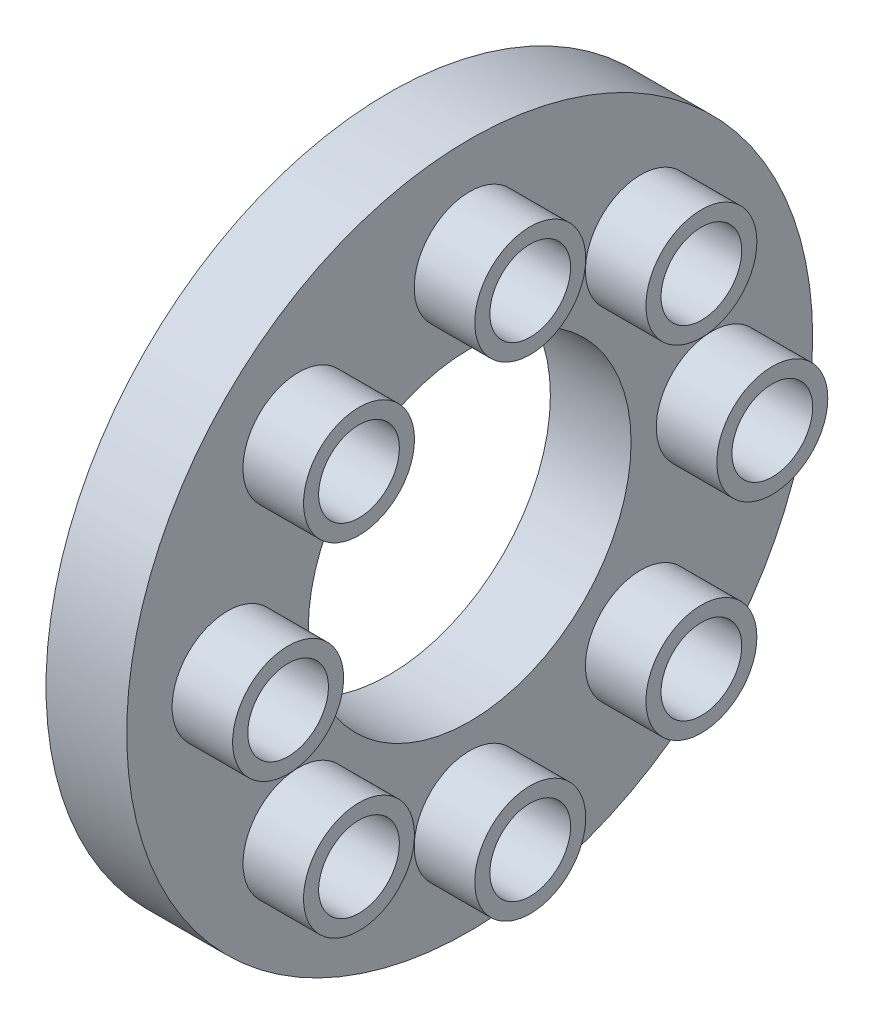
ISO-10303-21;
HEADER;
FILE_DESCRIPTION(('STEP AP214'),'2;1');
FILE_NAME('part.step','',(''),(''),'','','');
FILE_SCHEMA(('AUTOMOTIVE_DESIGN { 1 0 10303 214 1 1 1 1 }'));
ENDSEC;
DATA;
#1=APPLICATION_CONTEXT('core data for automotive mechanical design processes');
#2=APPLICATION_PROTOCOL_DEFINITION('international standard','automotive_design',2000,#1);
#3=PRODUCT_CONTEXT('',#1,'mechanical');
#4=PRODUCT('Part','Part','',(#3));
#5=PRODUCT_RELATED_PRODUCT_CATEGORY('part','',(#4));
#6=PRODUCT_DEFINITION_FORMATION('','',#4);
#7=PRODUCT_DEFINITION_CONTEXT('part definition',#1,'design');
#8=PRODUCT_DEFINITION('design','',#6,#7);
#9=PRODUCT_DEFINITION_SHAPE('','',#8);
#10=(LENGTH_UNIT() NAMED_UNIT(*) SI_UNIT(.MILLI.,.METRE.));
#11=(NAMED_UNIT(*) PLANE_ANGLE_UNIT() SI_UNIT($,.RADIAN.));
#12=(NAMED_UNIT(*) SI_UNIT($,.STERADIAN.) SOLID_ANGLE_UNIT());
#13=UNCERTAINTY_MEASURE_WITH_UNIT(LENGTH_MEASURE(1.E-05),#10,'distance_accuracy_value','');
#14=(GEOMETRIC_REPRESENTATION_CONTEXT(3) GLOBAL_UNCERTAINTY_ASSIGNED_CONTEXT((#13)) GLOBAL_UNIT_ASSIGNED_CONTEXT((#10,
#11,#12)) REPRESENTATION_CONTEXT('',''));
#15=CARTESIAN_POINT('',(0.,0.,0.));
#16=DIRECTION('',(0.,0.,1.));
#17=DIRECTION('',(1.,0.,0.));
#18=AXIS2_PLACEMENT_3D('',#15,#16,#17);
#19=CARTESIAN_POINT('',(4.,0.,0.));
#20=DIRECTION('',(1.,0.,0.));
#21=DIRECTION('',(0.,0.,-1.));
#22=AXIS2_PLACEMENT_3D('',#19,#20,#21);
#23=PLANE('',#22);
#24=CARTESIAN_POINT('',(4.,8.48528137423881,8.48528137423884));
#25=DIRECTION('',(1.,0.,0.));
#26=DIRECTION('',(0.,0.,-1.));
#27=AXIS2_PLACEMENT_3D('',#24,#25,#26);
#28=CIRCLE('',#27,2.75);
#29=CARTESIAN_POINT('',(4.,8.48528137423881,5.73528137423884));
#30=VERTEX_POINT('',#29);
#31=EDGE_CURVE('E131',#30,#30,#28,.T.);
#32=ORIENTED_EDGE('',*,*,#31,.F.);
#33=EDGE_LOOP('',(#32));
#34=FACE_BOUND('',#33,.T.);
#35=CARTESIAN_POINT('',(4.,-8.48528137423859,8.48528137423857));
#36=DIRECTION('',(1.,0.,0.));
#37=DIRECTION('',(0.,0.,-1.));
#38=AXIS2_PLACEMENT_3D('',#35,#36,#37);
#39=CIRCLE('',#38,2.75000000000028);
#40=CARTESIAN_POINT('',(4.,-8.48528137423859,5.7352813742383));
#41=VERTEX_POINT('',#40);
#42=EDGE_CURVE('E113',#41,#41,#39,.T.);
#43=ORIENTED_EDGE('',*,*,#42,.F.);
#44=EDGE_LOOP('',(#43));
#45=FACE_BOUND('',#44,.T.);
#46=CARTESIAN_POINT('',(4.,-8.48528137423875,-8.4852813742389));
#47=DIRECTION('',(1.,0.,0.));
#48=DIRECTION('',(0.,0.,-1.));
#49=AXIS2_PLACEMENT_3D('',#46,#47,#48);
#50=CIRCLE('',#49,2.75);
#51=CARTESIAN_POINT('',(4.,-8.48528137423875,-11.2352813742389));
#52=VERTEX_POINT('',#51);
#53=EDGE_CURVE('E95',#52,#52,#50,.T.);
#54=ORIENTED_EDGE('',*,*,#53,.F.);
#55=EDGE_LOOP('',(#54));
#56=FACE_BOUND('',#55,.T.);
#57=CARTESIAN_POINT('',(4.,8.48528137423893,-8.48528137423872));
#58=DIRECTION('',(1.,0.,0.));
#59=DIRECTION('',(0.,0.,-1.));
#60=AXIS2_PLACEMENT_3D('',#57,#58,#59);
#61=CIRCLE('',#60,2.75);
#62=CARTESIAN_POINT('',(4.,8.48528137423893,-11.2352813742387));
#63=VERTEX_POINT('',#62);
#64=EDGE_CURVE('E77',#63,#63,#61,.T.);
#65=ORIENTED_EDGE('',*,*,#64,.F.);
#66=EDGE_LOOP('',(#65));
#67=FACE_BOUND('',#66,.T.);
#68=CARTESIAN_POINT('',(4.,0.,0.));
#69=DIRECTION('',(1.,0.,0.));
#70=DIRECTION('',(0.,0.,-1.));
#71=AXIS2_PLACEMENT_3D('',#68,#69,#70);
#72=CIRCLE('',#71,8.);
#73=CARTESIAN_POINT('',(4.,0.,-8.));
#74=VERTEX_POINT('',#73);
#75=EDGE_CURVE('E49',#74,#74,#72,.T.);
#76=ORIENTED_EDGE('',*,*,#75,.F.);
#77=EDGE_LOOP('',(#76));
#78=FACE_BOUND('',#77,.T.);
#79=CARTESIAN_POINT('',(4.,0.,0.));
#80=DIRECTION('',(1.,0.,0.));
#81=DIRECTION('',(0.,0.,-1.));
#82=AXIS2_PLACEMENT_3D('',#79,#80,#81);
#83=CIRCLE('',#82,17.);
#84=CARTESIAN_POINT('',(4.,0.,-17.));
#85=VERTEX_POINT('',#84);
#86=EDGE_CURVE('E10',#85,#85,#83,.T.);
#87=ORIENTED_EDGE('',*,*,#86,.T.);
#88=EDGE_LOOP('',(#87));
#89=FACE_BOUND('',#88,.T.);
#90=CARTESIAN_POINT('',(4.,1.30104260698261E-13,-12.0000000000004));
#91=DIRECTION('',(1.,0.,0.));
#92=DIRECTION('',(0.,0.,-1.));
#93=AXIS2_PLACEMENT_3D('',#90,#91,#92);
#94=CIRCLE('',#93,2.75);
#95=CARTESIAN_POINT('',(4.,1.30104260698261E-13,-14.7500000000004));
#96=VERTEX_POINT('',#95);
#97=EDGE_CURVE('E86',#96,#96,#94,.T.);
#98=ORIENTED_EDGE('',*,*,#97,.F.);
#99=EDGE_LOOP('',(#98));
#100=FACE_BOUND('',#99,.T.);
#101=CARTESIAN_POINT('',(4.,-12.,-1.50540517395564E-13));
#102=DIRECTION('',(1.,0.,0.));
#103=DIRECTION('',(0.,0.,-1.));
#104=AXIS2_PLACEMENT_3D('',#101,#102,#103);
#105=CIRCLE('',#104,2.75000000000034);
#106=CARTESIAN_POINT('',(4.,-12.,-2.75000000000049));
#107=VERTEX_POINT('',#106);
#108=EDGE_CURVE('E104',#107,#107,#105,.T.);
#109=ORIENTED_EDGE('',*,*,#108,.F.);
#110=EDGE_LOOP('',(#109));
#111=FACE_BOUND('',#110,.T.);
#112=CARTESIAN_POINT('',(4.,0.,12.0000000000004));
#113=DIRECTION('',(1.,0.,0.));
#114=DIRECTION('',(0.,0.,-1.));
#115=AXIS2_PLACEMENT_3D('',#112,#113,#114);
#116=CIRCLE('',#115,2.75);
#117=CARTESIAN_POINT('',(4.,0.,9.25000000000036));
#118=VERTEX_POINT('',#117);
#119=EDGE_CURVE('E122',#118,#118,#116,.T.);
#120=ORIENTED_EDGE('',*,*,#119,.F.);
#121=EDGE_LOOP('',(#120));
#122=FACE_BOUND('',#121,.T.);
#123=CARTESIAN_POINT('',(4.,12.0000000000004,0.));
#124=DIRECTION('',(1.,0.,0.));
#125=DIRECTION('',(0.,0.,-1.));
#126=AXIS2_PLACEMENT_3D('',#123,#124,#125);
#127=CIRCLE('',#126,2.75);
#128=CARTESIAN_POINT('',(4.,12.0000000000004,-2.74999999999999));
#129=VERTEX_POINT('',#128);
#130=EDGE_CURVE('E140',#129,#129,#127,.T.);
#131=ORIENTED_EDGE('',*,*,#130,.F.);
#132=EDGE_LOOP('',(#131));
#133=FACE_BOUND('',#132,.T.);
#134=ADVANCED_FACE('F34',(#34,#45,#56,#67,#78,#89,#100,#111,#122,#133),#23,.T.);
#135=CARTESIAN_POINT('',(0.,0.,0.));
#136=DIRECTION('',(1.,0.,0.));
#137=DIRECTION('',(0.,0.,-1.));
#138=AXIS2_PLACEMENT_3D('',#135,#136,#137);
#139=PLANE('',#138);
#140=CARTESIAN_POINT('',(0.,0.,0.));
#141=DIRECTION('',(1.,0.,0.));
#142=DIRECTION('',(0.,0.,-1.));
#143=AXIS2_PLACEMENT_3D('',#140,#141,#142);
#144=CIRCLE('',#143,17.);
#145=CARTESIAN_POINT('',(0.,0.,-17.));
#146=VERTEX_POINT('',#145);
#147=EDGE_CURVE('E38',#146,#146,#144,.T.);
#148=ORIENTED_EDGE('',*,*,#147,.F.);
#149=EDGE_LOOP('',(#148));
#150=FACE_BOUND('',#149,.T.);
#151=CARTESIAN_POINT('',(0.,12.,0.));
#152=DIRECTION('',(1.,0.,0.));
#153=DIRECTION('',(0.,0.,-1.));
#154=AXIS2_PLACEMENT_3D('',#151,#152,#153);
#155=CIRCLE('',#154,2.);
#156=CARTESIAN_POINT('',(0.,12.,-2.));
#157=VERTEX_POINT('',#156);
#158=EDGE_CURVE('E45',#157,#157,#155,.T.);
#159=ORIENTED_EDGE('',*,*,#158,.T.);
#160=EDGE_LOOP('',(#159));
#161=FACE_BOUND('',#160,.T.);
#162=CARTESIAN_POINT('',(0.,0.,0.));
#163=DIRECTION('',(1.,0.,0.));
#164=DIRECTION('',(0.,0.,-1.));
#165=AXIS2_PLACEMENT_3D('',#162,#163,#164);
#166=CIRCLE('',#165,8.);
#167=CARTESIAN_POINT('',(0.,0.,-8.));
#168=VERTEX_POINT('',#167);
#169=EDGE_CURVE('E50',#168,#168,#166,.T.);
#170=ORIENTED_EDGE('',*,*,#169,.T.);
#171=EDGE_LOOP('',(#170));
#172=FACE_BOUND('',#171,.T.);
#173=CARTESIAN_POINT('',(0.,8.48528137423893,-8.48528137423872));
#174=DIRECTION('',(1.,0.,0.));
#175=DIRECTION('',(0.,0.,-1.));
#176=AXIS2_PLACEMENT_3D('',#173,#174,#175);
#177=CIRCLE('',#176,2.00000000000006);
#178=CARTESIAN_POINT('',(0.,8.48528137423893,-10.4852813742388));
#179=VERTEX_POINT('',#178);
#180=EDGE_CURVE('E53',#179,#179,#177,.T.);
#181=ORIENTED_EDGE('',*,*,#180,.T.);
#182=EDGE_LOOP('',(#181));
#183=FACE_BOUND('',#182,.T.);
#184=CARTESIAN_POINT('',(0.,5.10121193588295E-13,-12.0000000000005));
#185=DIRECTION('',(1.,0.,0.));
#186=DIRECTION('',(0.,0.,-1.));
#187=AXIS2_PLACEMENT_3D('',#184,#185,#186);
#188=CIRCLE('',#187,2.00000000000038);
#189=CARTESIAN_POINT('',(0.,5.10121193588295E-13,-14.0000000000009));
#190=VERTEX_POINT('',#189);
#191=EDGE_CURVE('E58',#190,#190,#188,.T.);
#192=ORIENTED_EDGE('',*,*,#191,.T.);
#193=EDGE_LOOP('',(#192));
#194=FACE_BOUND('',#193,.T.);
#195=CARTESIAN_POINT('',(0.,-8.48528137423821,-8.48528137423944));
#196=DIRECTION('',(1.,0.,0.));
#197=DIRECTION('',(0.,0.,-1.));
#198=AXIS2_PLACEMENT_3D('',#195,#196,#197);
#199=CIRCLE('',#198,2.00000000000079);
#200=CARTESIAN_POINT('',(0.,-8.48528137423821,-10.4852813742402));
#201=VERTEX_POINT('',#200);
#202=EDGE_CURVE('E61',#201,#201,#199,.T.);
#203=ORIENTED_EDGE('',*,*,#202,.T.);
#204=EDGE_LOOP('',(#203));
#205=FACE_BOUND('',#204,.T.);
#206=CARTESIAN_POINT('',(0.,-12.,-1.02024238717659E-12));
#207=DIRECTION('',(1.,0.,0.));
#208=DIRECTION('',(0.,0.,-1.));
#209=AXIS2_PLACEMENT_3D('',#206,#207,#208);
#210=CIRCLE('',#209,2.00000000000106);
#211=CARTESIAN_POINT('',(0.,-12.,-2.00000000000208));
#212=VERTEX_POINT('',#211);
#213=EDGE_CURVE('E64',#212,#212,#210,.T.);
#214=ORIENTED_EDGE('',*,*,#213,.T.);
#215=EDGE_LOOP('',(#214));
#216=FACE_BOUND('',#215,.T.);
#217=CARTESIAN_POINT('',(0.,-8.48528137423893,8.4852813742377));
#218=DIRECTION('',(1.,0.,0.));
#219=DIRECTION('',(0.,0.,-1.));
#220=AXIS2_PLACEMENT_3D('',#217,#218,#219);
#221=CIRCLE('',#220,2.00000000000104);
#222=CARTESIAN_POINT('',(0.,-8.48528137423893,6.48528137423666));
#223=VERTEX_POINT('',#222);
#224=EDGE_CURVE('E67',#223,#223,#221,.T.);
#225=ORIENTED_EDGE('',*,*,#224,.T.);
#226=EDGE_LOOP('',(#225));
#227=FACE_BOUND('',#226,.T.);
#228=CARTESIAN_POINT('',(0.,-5.11590769747272E-13,11.9999999999995));
#229=DIRECTION('',(1.,0.,0.));
#230=DIRECTION('',(0.,0.,-1.));
#231=AXIS2_PLACEMENT_3D('',#228,#229,#230);
#232=CIRCLE('',#231,2.00000000000076);
#233=CARTESIAN_POINT('',(0.,-5.11590769747272E-13,9.99999999999873));
#234=VERTEX_POINT('',#233);
#235=EDGE_CURVE('E70',#234,#234,#232,.T.);
#236=ORIENTED_EDGE('',*,*,#235,.T.);
#237=EDGE_LOOP('',(#236));
#238=FACE_BOUND('',#237,.T.);
#239=CARTESIAN_POINT('',(0.,8.48528137423821,8.48528137423842));
#240=DIRECTION('',(1.,0.,0.));
#241=DIRECTION('',(0.,0.,-1.));
#242=AXIS2_PLACEMENT_3D('',#239,#240,#241);
#243=CIRCLE('',#242,2.00000000000039);
#244=CARTESIAN_POINT('',(0.,8.48528137423821,6.48528137423803));
#245=VERTEX_POINT('',#244);
#246=EDGE_CURVE('E73',#245,#245,#243,.T.);
#247=ORIENTED_EDGE('',*,*,#246,.T.);
#248=EDGE_LOOP('',(#247));
#249=FACE_BOUND('',#248,.T.);
#250=ADVANCED_FACE('F167',(#150,#161,#172,#183,#194,#205,#216,#227,#238,#249),#139,.F.);
#251=CARTESIAN_POINT('',(4.,0.,0.));
#252=DIRECTION('',(-1.,0.,0.));
#253=DIRECTION('',(0.,0.,1.));
#254=AXIS2_PLACEMENT_3D('',#251,#252,#253);
#255=CYLINDRICAL_SURFACE('',#254,17.);
#256=ORIENTED_EDGE('',*,*,#86,.F.);
#257=EDGE_LOOP('',(#256));
#258=FACE_BOUND('',#257,.T.);
#259=ORIENTED_EDGE('',*,*,#147,.T.);
#260=EDGE_LOOP('',(#259));
#261=FACE_BOUND('',#260,.T.);
#262=ADVANCED_FACE('F36',(#258,#261),#255,.T.);
#263=CARTESIAN_POINT('',(4.,12.,0.));
#264=DIRECTION('',(-1.,0.,0.));
#265=DIRECTION('',(0.,0.,1.));
#266=AXIS2_PLACEMENT_3D('',#263,#264,#265);
#267=CYLINDRICAL_SURFACE('',#266,2.);
#268=ORIENTED_EDGE('',*,*,#158,.F.);
#269=EDGE_LOOP('',(#268));
#270=FACE_BOUND('',#269,.T.);
#271=CARTESIAN_POINT('',(7.,12.0000000000004,0.));
#272=DIRECTION('',(1.,0.,0.));
#273=DIRECTION('',(0.,0.,-1.));
#274=AXIS2_PLACEMENT_3D('',#271,#272,#273);
#275=CIRCLE('',#274,2.00000000000006);
#276=CARTESIAN_POINT('',(7.,12.0000000000004,-2.00000000000006));
#277=VERTEX_POINT('',#276);
#278=EDGE_CURVE('E143',#277,#277,#275,.T.);
#279=ORIENTED_EDGE('',*,*,#278,.T.);
#280=EDGE_LOOP('',(#279));
#281=FACE_BOUND('',#280,.T.);
#282=ADVANCED_FACE('F149',(#270,#281),#267,.F.);
#283=CARTESIAN_POINT('',(4.,0.,0.));
#284=DIRECTION('',(-1.,0.,0.));
#285=DIRECTION('',(0.,0.,1.));
#286=AXIS2_PLACEMENT_3D('',#283,#284,#285);
#287=CYLINDRICAL_SURFACE('',#286,8.);
#288=ORIENTED_EDGE('',*,*,#75,.T.);
#289=EDGE_LOOP('',(#288));
#290=FACE_BOUND('',#289,.T.);
#291=ORIENTED_EDGE('',*,*,#169,.F.);
#292=EDGE_LOOP('',(#291));
#293=FACE_BOUND('',#292,.T.);
#294=ADVANCED_FACE('F179',(#290,#293),#287,.F.);
#295=CARTESIAN_POINT('',(4.,8.48528137423893,-8.48528137423872));
#296=DIRECTION('',(-1.,0.,0.));
#297=DIRECTION('',(0.,0.,1.));
#298=AXIS2_PLACEMENT_3D('',#295,#296,#297);
#299=CYLINDRICAL_SURFACE('',#298,2.00000000000006);
#300=ORIENTED_EDGE('',*,*,#180,.F.);
#301=EDGE_LOOP('',(#300));
#302=FACE_BOUND('',#301,.T.);
#303=CARTESIAN_POINT('',(7.,8.48528137423893,-8.48528137423872));
#304=DIRECTION('',(1.,0.,0.));
#305=DIRECTION('',(0.,0.,-1.));
#306=AXIS2_PLACEMENT_3D('',#303,#304,#305);
#307=CIRCLE('',#306,2.00000000000006);
#308=CARTESIAN_POINT('',(7.,8.48528137423893,-10.4852813742388));
#309=VERTEX_POINT('',#308);
#310=EDGE_CURVE('E80',#309,#309,#307,.T.);
#311=ORIENTED_EDGE('',*,*,#310,.T.);
#312=EDGE_LOOP('',(#311));
#313=FACE_BOUND('',#312,.T.);
#314=ADVANCED_FACE('F183',(#302,#313),#299,.F.);
#315=CARTESIAN_POINT('',(4.,5.10121193588295E-13,-12.0000000000005));
#316=DIRECTION('',(-1.,0.,0.));
#317=DIRECTION('',(0.,0.,1.));
#318=AXIS2_PLACEMENT_3D('',#315,#316,#317);
#319=CYLINDRICAL_SURFACE('',#318,2.00000000000038);
#320=ORIENTED_EDGE('',*,*,#191,.F.);
#321=EDGE_LOOP('',(#320));
#322=FACE_BOUND('',#321,.T.);
#323=CARTESIAN_POINT('',(7.,1.30104260698261E-13,-12.0000000000004));
#324=DIRECTION('',(1.,0.,0.));
#325=DIRECTION('',(0.,0.,-1.));
#326=AXIS2_PLACEMENT_3D('',#323,#324,#325);
#327=CIRCLE('',#326,2.00000000000006);
#328=CARTESIAN_POINT('',(7.,1.30104260698261E-13,-14.0000000000004));
#329=VERTEX_POINT('',#328);
#330=EDGE_CURVE('E89',#329,#329,#327,.T.);
#331=ORIENTED_EDGE('',*,*,#330,.T.);
#332=EDGE_LOOP('',(#331));
#333=FACE_BOUND('',#332,.T.);
#334=ADVANCED_FACE('F187',(#322,#333),#319,.F.);
#335=CARTESIAN_POINT('',(4.,-8.48528137423821,-8.48528137423944));
#336=DIRECTION('',(-1.,0.,0.));
#337=DIRECTION('',(0.,0.,1.));
#338=AXIS2_PLACEMENT_3D('',#335,#336,#337);
#339=CYLINDRICAL_SURFACE('',#338,2.00000000000079);
#340=ORIENTED_EDGE('',*,*,#202,.F.);
#341=EDGE_LOOP('',(#340));
#342=FACE_BOUND('',#341,.T.);
#343=CARTESIAN_POINT('',(7.,-8.48528137423875,-8.4852813742389));
#344=DIRECTION('',(1.,0.,0.));
#345=DIRECTION('',(0.,0.,-1.));
#346=AXIS2_PLACEMENT_3D('',#343,#344,#345);
#347=CIRCLE('',#346,2.00000000000006);
#348=CARTESIAN_POINT('',(7.,-8.48528137423875,-10.485281374239));
#349=VERTEX_POINT('',#348);
#350=EDGE_CURVE('E98',#349,#349,#347,.T.);
#351=ORIENTED_EDGE('',*,*,#350,.T.);
#352=EDGE_LOOP('',(#351));
#353=FACE_BOUND('',#352,.T.);
#354=ADVANCED_FACE('F191',(#342,#353),#339,.F.);
#355=CARTESIAN_POINT('',(4.,-12.,-1.02024238717659E-12));
#356=DIRECTION('',(-1.,0.,0.));
#357=DIRECTION('',(0.,0.,1.));
#358=AXIS2_PLACEMENT_3D('',#355,#356,#357);
#359=CYLINDRICAL_SURFACE('',#358,2.00000000000106);
#360=ORIENTED_EDGE('',*,*,#213,.F.);
#361=EDGE_LOOP('',(#360));
#362=FACE_BOUND('',#361,.T.);
#363=CARTESIAN_POINT('',(7.,-12.,-1.50540517395564E-13));
#364=DIRECTION('',(1.,0.,0.));
#365=DIRECTION('',(0.,0.,-1.));
#366=AXIS2_PLACEMENT_3D('',#363,#364,#365);
#367=CIRCLE('',#366,2.0000000000004);
#368=CARTESIAN_POINT('',(7.,-12.,-2.00000000000055));
#369=VERTEX_POINT('',#368);
#370=EDGE_CURVE('E107',#369,#369,#367,.T.);
#371=ORIENTED_EDGE('',*,*,#370,.T.);
#372=EDGE_LOOP('',(#371));
#373=FACE_BOUND('',#372,.T.);
#374=ADVANCED_FACE('F195',(#362,#373),#359,.F.);
#375=CARTESIAN_POINT('',(4.,-8.48528137423893,8.4852813742377));
#376=DIRECTION('',(-1.,0.,0.));
#377=DIRECTION('',(0.,0.,1.));
#378=AXIS2_PLACEMENT_3D('',#375,#376,#377);
#379=CYLINDRICAL_SURFACE('',#378,2.00000000000104);
#380=ORIENTED_EDGE('',*,*,#224,.F.);
#381=EDGE_LOOP('',(#380));
#382=FACE_BOUND('',#381,.T.);
#383=CARTESIAN_POINT('',(7.,-8.48528137423859,8.48528137423857));
#384=DIRECTION('',(1.,0.,0.));
#385=DIRECTION('',(0.,0.,-1.));
#386=AXIS2_PLACEMENT_3D('',#383,#384,#385);
#387=CIRCLE('',#386,2.00000000000034);
#388=CARTESIAN_POINT('',(7.,-8.48528137423859,6.48528137423823));
#389=VERTEX_POINT('',#388);
#390=EDGE_CURVE('E116',#389,#389,#387,.T.);
#391=ORIENTED_EDGE('',*,*,#390,.T.);
#392=EDGE_LOOP('',(#391));
#393=FACE_BOUND('',#392,.T.);
#394=ADVANCED_FACE('F199',(#382,#393),#379,.F.);
#395=CARTESIAN_POINT('',(4.,-5.11590769747272E-13,11.9999999999995));
#396=DIRECTION('',(-1.,0.,0.));
#397=DIRECTION('',(0.,0.,1.));
#398=AXIS2_PLACEMENT_3D('',#395,#396,#397);
#399=CYLINDRICAL_SURFACE('',#398,2.00000000000076);
#400=ORIENTED_EDGE('',*,*,#235,.F.);
#401=EDGE_LOOP('',(#400));
#402=FACE_BOUND('',#401,.T.);
#403=CARTESIAN_POINT('',(7.,0.,12.0000000000004));
#404=DIRECTION('',(1.,0.,0.));
#405=DIRECTION('',(0.,0.,-1.));
#406=AXIS2_PLACEMENT_3D('',#403,#404,#405);
#407=CIRCLE('',#406,2.00000000000006);
#408=CARTESIAN_POINT('',(7.,0.,10.0000000000003));
#409=VERTEX_POINT('',#408);
#410=EDGE_CURVE('E125',#409,#409,#407,.T.);
#411=ORIENTED_EDGE('',*,*,#410,.T.);
#412=EDGE_LOOP('',(#411));
#413=FACE_BOUND('',#412,.T.);
#414=ADVANCED_FACE('F203',(#402,#413),#399,.F.);
#415=CARTESIAN_POINT('',(4.,8.48528137423821,8.48528137423842));
#416=DIRECTION('',(-1.,0.,0.));
#417=DIRECTION('',(0.,0.,1.));
#418=AXIS2_PLACEMENT_3D('',#415,#416,#417);
#419=CYLINDRICAL_SURFACE('',#418,2.00000000000039);
#420=ORIENTED_EDGE('',*,*,#246,.F.);
#421=EDGE_LOOP('',(#420));
#422=FACE_BOUND('',#421,.T.);
#423=CARTESIAN_POINT('',(7.,8.48528137423881,8.48528137423884));
#424=DIRECTION('',(1.,0.,0.));
#425=DIRECTION('',(0.,0.,-1.));
#426=AXIS2_PLACEMENT_3D('',#423,#424,#425);
#427=CIRCLE('',#426,2.00000000000006);
#428=CARTESIAN_POINT('',(7.,8.48528137423881,6.48528137423878));
#429=VERTEX_POINT('',#428);
#430=EDGE_CURVE('E134',#429,#429,#427,.T.);
#431=ORIENTED_EDGE('',*,*,#430,.T.);
#432=EDGE_LOOP('',(#431));
#433=FACE_BOUND('',#432,.T.);
#434=ADVANCED_FACE('F207',(#422,#433),#419,.F.);
#435=CARTESIAN_POINT('',(7.,8.48528137423893,-8.48528137423872));
#436=DIRECTION('',(1.,0.,0.));
#437=DIRECTION('',(0.,0.,-1.));
#438=AXIS2_PLACEMENT_3D('',#435,#436,#437);
#439=PLANE('',#438);
#440=CARTESIAN_POINT('',(7.,8.48528137423893,-8.48528137423872));
#441=DIRECTION('',(1.,0.,0.));
#442=DIRECTION('',(0.,0.,-1.));
#443=AXIS2_PLACEMENT_3D('',#440,#441,#442);
#444=CIRCLE('',#443,2.75);
#445=CARTESIAN_POINT('',(7.,8.48528137423893,-11.2352813742387));
#446=VERTEX_POINT('',#445);
#447=EDGE_CURVE('E76',#446,#446,#444,.T.);
#448=ORIENTED_EDGE('',*,*,#447,.T.);
#449=EDGE_LOOP('',(#448));
#450=FACE_BOUND('',#449,.T.);
#451=ORIENTED_EDGE('',*,*,#310,.F.);
#452=EDGE_LOOP('',(#451));
#453=FACE_BOUND('',#452,.T.);
#454=ADVANCED_FACE('F211',(#450,#453),#439,.T.);
#455=CARTESIAN_POINT('',(7.,8.48528137423893,-8.48528137423872));
#456=DIRECTION('',(-1.,0.,0.));
#457=DIRECTION('',(0.,0.,1.));
#458=AXIS2_PLACEMENT_3D('',#455,#456,#457);
#459=CYLINDRICAL_SURFACE('',#458,2.75);
#460=ORIENTED_EDGE('',*,*,#447,.F.);
#461=EDGE_LOOP('',(#460));
#462=FACE_BOUND('',#461,.T.);
#463=ORIENTED_EDGE('',*,*,#64,.T.);
#464=EDGE_LOOP('',(#463));
#465=FACE_BOUND('',#464,.T.);
#466=ADVANCED_FACE('F213',(#462,#465),#459,.T.);
#467=CARTESIAN_POINT('',(7.,1.30104260698261E-13,-12.0000000000004));
#468=DIRECTION('',(1.,0.,0.));
#469=DIRECTION('',(0.,0.,-1.));
#470=AXIS2_PLACEMENT_3D('',#467,#468,#469);
#471=PLANE('',#470);
#472=CARTESIAN_POINT('',(7.,1.30104260698261E-13,-12.0000000000004));
#473=DIRECTION('',(1.,0.,0.));
#474=DIRECTION('',(0.,0.,-1.));
#475=AXIS2_PLACEMENT_3D('',#472,#473,#474);
#476=CIRCLE('',#475,2.75);
#477=CARTESIAN_POINT('',(7.,1.30104260698261E-13,-14.7500000000004));
#478=VERTEX_POINT('',#477);
#479=EDGE_CURVE('E85',#478,#478,#476,.T.);
#480=ORIENTED_EDGE('',*,*,#479,.T.);
#481=EDGE_LOOP('',(#480));
#482=FACE_BOUND('',#481,.T.);
#483=ORIENTED_EDGE('',*,*,#330,.F.);
#484=EDGE_LOOP('',(#483));
#485=FACE_BOUND('',#484,.T.);
#486=ADVANCED_FACE('F216',(#482,#485),#471,.T.);
#487=CARTESIAN_POINT('',(7.,1.30104260698261E-13,-12.0000000000004));
#488=DIRECTION('',(-1.,0.,0.));
#489=DIRECTION('',(0.,0.,1.));
#490=AXIS2_PLACEMENT_3D('',#487,#488,#489);
#491=CYLINDRICAL_SURFACE('',#490,2.75);
#492=ORIENTED_EDGE('',*,*,#479,.F.);
#493=EDGE_LOOP('',(#492));
#494=FACE_BOUND('',#493,.T.);
#495=ORIENTED_EDGE('',*,*,#97,.T.);
#496=EDGE_LOOP('',(#495));
#497=FACE_BOUND('',#496,.T.);
#498=ADVANCED_FACE('F221',(#494,#497),#491,.T.);
#499=CARTESIAN_POINT('',(7.,-8.48528137423875,-8.4852813742389));
#500=DIRECTION('',(1.,0.,0.));
#501=DIRECTION('',(0.,0.,-1.));
#502=AXIS2_PLACEMENT_3D('',#499,#500,#501);
#503=PLANE('',#502);
#504=CARTESIAN_POINT('',(7.,-8.48528137423875,-8.4852813742389));
#505=DIRECTION('',(1.,0.,0.));
#506=DIRECTION('',(0.,0.,-1.));
#507=AXIS2_PLACEMENT_3D('',#504,#505,#506);
#508=CIRCLE('',#507,2.75);
#509=CARTESIAN_POINT('',(7.,-8.48528137423875,-11.2352813742389));
#510=VERTEX_POINT('',#509);
#511=EDGE_CURVE('E94',#510,#510,#508,.T.);
#512=ORIENTED_EDGE('',*,*,#511,.T.);
#513=EDGE_LOOP('',(#512));
#514=FACE_BOUND('',#513,.T.);
#515=ORIENTED_EDGE('',*,*,#350,.F.);
#516=EDGE_LOOP('',(#515));
#517=FACE_BOUND('',#516,.T.);
#518=ADVANCED_FACE('F224',(#514,#517),#503,.T.);
#519=CARTESIAN_POINT('',(7.,-8.48528137423875,-8.4852813742389));
#520=DIRECTION('',(-1.,0.,0.));
#521=DIRECTION('',(0.,0.,1.));
#522=AXIS2_PLACEMENT_3D('',#519,#520,#521);
#523=CYLINDRICAL_SURFACE('',#522,2.75);
#524=ORIENTED_EDGE('',*,*,#511,.F.);
#525=EDGE_LOOP('',(#524));
#526=FACE_BOUND('',#525,.T.);
#527=ORIENTED_EDGE('',*,*,#53,.T.);
#528=EDGE_LOOP('',(#527));
#529=FACE_BOUND('',#528,.T.);
#530=ADVANCED_FACE('F229',(#526,#529),#523,.T.);
#531=CARTESIAN_POINT('',(7.,-12.,-1.50540517395564E-13));
#532=DIRECTION('',(1.,0.,0.));
#533=DIRECTION('',(0.,0.,-1.));
#534=AXIS2_PLACEMENT_3D('',#531,#532,#533);
#535=PLANE('',#534);
#536=CARTESIAN_POINT('',(7.,-12.,-1.50540517395564E-13));
#537=DIRECTION('',(1.,0.,0.));
#538=DIRECTION('',(0.,0.,-1.));
#539=AXIS2_PLACEMENT_3D('',#536,#537,#538);
#540=CIRCLE('',#539,2.75000000000034);
#541=CARTESIAN_POINT('',(7.,-12.,-2.75000000000049));
#542=VERTEX_POINT('',#541);
#543=EDGE_CURVE('E103',#542,#542,#540,.T.);
#544=ORIENTED_EDGE('',*,*,#543,.T.);
#545=EDGE_LOOP('',(#544));
#546=FACE_BOUND('',#545,.T.);
#547=ORIENTED_EDGE('',*,*,#370,.F.);
#548=EDGE_LOOP('',(#547));
#549=FACE_BOUND('',#548,.T.);
#550=ADVANCED_FACE('F232',(#546,#549),#535,.T.);
#551=CARTESIAN_POINT('',(7.,-12.,-1.50540517395564E-13));
#552=DIRECTION('',(-1.,0.,0.));
#553=DIRECTION('',(0.,0.,1.));
#554=AXIS2_PLACEMENT_3D('',#551,#552,#553);
#555=CYLINDRICAL_SURFACE('',#554,2.75000000000034);
#556=ORIENTED_EDGE('',*,*,#543,.F.);
#557=EDGE_LOOP('',(#556));
#558=FACE_BOUND('',#557,.T.);
#559=ORIENTED_EDGE('',*,*,#108,.T.);
#560=EDGE_LOOP('',(#559));
#561=FACE_BOUND('',#560,.T.);
#562=ADVANCED_FACE('F237',(#558,#561),#555,.T.);
#563=CARTESIAN_POINT('',(7.,-8.48528137423859,8.48528137423857));
#564=DIRECTION('',(1.,0.,0.));
#565=DIRECTION('',(0.,0.,-1.));
#566=AXIS2_PLACEMENT_3D('',#563,#564,#565);
#567=PLANE('',#566);
#568=CARTESIAN_POINT('',(7.,-8.48528137423859,8.48528137423857));
#569=DIRECTION('',(1.,0.,0.));
#570=DIRECTION('',(0.,0.,-1.));
#571=AXIS2_PLACEMENT_3D('',#568,#569,#570);
#572=CIRCLE('',#571,2.75000000000028);
#573=CARTESIAN_POINT('',(7.,-8.48528137423859,5.7352813742383));
#574=VERTEX_POINT('',#573);
#575=EDGE_CURVE('E112',#574,#574,#572,.T.);
#576=ORIENTED_EDGE('',*,*,#575,.T.);
#577=EDGE_LOOP('',(#576));
#578=FACE_BOUND('',#577,.T.);
#579=ORIENTED_EDGE('',*,*,#390,.F.);
#580=EDGE_LOOP('',(#579));
#581=FACE_BOUND('',#580,.T.);
#582=ADVANCED_FACE('F240',(#578,#581),#567,.T.);
#583=CARTESIAN_POINT('',(7.,-8.48528137423859,8.48528137423857));
#584=DIRECTION('',(-1.,0.,0.));
#585=DIRECTION('',(0.,0.,1.));
#586=AXIS2_PLACEMENT_3D('',#583,#584,#585);
#587=CYLINDRICAL_SURFACE('',#586,2.75000000000028);
#588=ORIENTED_EDGE('',*,*,#575,.F.);
#589=EDGE_LOOP('',(#588));
#590=FACE_BOUND('',#589,.T.);
#591=ORIENTED_EDGE('',*,*,#42,.T.);
#592=EDGE_LOOP('',(#591));
#593=FACE_BOUND('',#592,.T.);
#594=ADVANCED_FACE('F245',(#590,#593),#587,.T.);
#595=CARTESIAN_POINT('',(7.,0.,12.0000000000004));
#596=DIRECTION('',(1.,0.,0.));
#597=DIRECTION('',(0.,0.,-1.));
#598=AXIS2_PLACEMENT_3D('',#595,#596,#597);
#599=PLANE('',#598);
#600=CARTESIAN_POINT('',(7.,0.,12.0000000000004));
#601=DIRECTION('',(1.,0.,0.));
#602=DIRECTION('',(0.,0.,-1.));
#603=AXIS2_PLACEMENT_3D('',#600,#601,#602);
#604=CIRCLE('',#603,2.75);
#605=CARTESIAN_POINT('',(7.,0.,9.25000000000036));
#606=VERTEX_POINT('',#605);
#607=EDGE_CURVE('E121',#606,#606,#604,.T.);
#608=ORIENTED_EDGE('',*,*,#607,.T.);
#609=EDGE_LOOP('',(#608));
#610=FACE_BOUND('',#609,.T.);
#611=ORIENTED_EDGE('',*,*,#410,.F.);
#612=EDGE_LOOP('',(#611));
#613=FACE_BOUND('',#612,.T.);
#614=ADVANCED_FACE('F248',(#610,#613),#599,.T.);
#615=CARTESIAN_POINT('',(7.,0.,12.0000000000004));
#616=DIRECTION('',(-1.,0.,0.));
#617=DIRECTION('',(0.,0.,1.));
#618=AXIS2_PLACEMENT_3D('',#615,#616,#617);
#619=CYLINDRICAL_SURFACE('',#618,2.75);
#620=ORIENTED_EDGE('',*,*,#607,.F.);
#621=EDGE_LOOP('',(#620));
#622=FACE_BOUND('',#621,.T.);
#623=ORIENTED_EDGE('',*,*,#119,.T.);
#624=EDGE_LOOP('',(#623));
#625=FACE_BOUND('',#624,.T.);
#626=ADVANCED_FACE('F253',(#622,#625),#619,.T.);
#627=CARTESIAN_POINT('',(7.,8.48528137423881,8.48528137423884));
#628=DIRECTION('',(1.,0.,0.));
#629=DIRECTION('',(0.,0.,-1.));
#630=AXIS2_PLACEMENT_3D('',#627,#628,#629);
#631=PLANE('',#630);
#632=CARTESIAN_POINT('',(7.,8.48528137423881,8.48528137423884));
#633=DIRECTION('',(1.,0.,0.));
#634=DIRECTION('',(0.,0.,-1.));
#635=AXIS2_PLACEMENT_3D('',#632,#633,#634);
#636=CIRCLE('',#635,2.75);
#637=CARTESIAN_POINT('',(7.,8.48528137423881,5.73528137423884));
#638=VERTEX_POINT('',#637);
#639=EDGE_CURVE('E130',#638,#638,#636,.T.);
#640=ORIENTED_EDGE('',*,*,#639,.T.);
#641=EDGE_LOOP('',(#640));
#642=FACE_BOUND('',#641,.T.);
#643=ORIENTED_EDGE('',*,*,#430,.F.);
#644=EDGE_LOOP('',(#643));
#645=FACE_BOUND('',#644,.T.);
#646=ADVANCED_FACE('F163',(#642,#645),#631,.T.);
#647=CARTESIAN_POINT('',(7.,8.48528137423881,8.48528137423884));
#648=DIRECTION('',(-1.,0.,0.));
#649=DIRECTION('',(0.,0.,1.));
#650=AXIS2_PLACEMENT_3D('',#647,#648,#649);
#651=CYLINDRICAL_SURFACE('',#650,2.75);
#652=ORIENTED_EDGE('',*,*,#639,.F.);
#653=EDGE_LOOP('',(#652));
#654=FACE_BOUND('',#653,.T.);
#655=ORIENTED_EDGE('',*,*,#31,.T.);
#656=EDGE_LOOP('',(#655));
#657=FACE_BOUND('',#656,.T.);
#658=ADVANCED_FACE('F154',(#654,#657),#651,.T.);
#659=CARTESIAN_POINT('',(7.,12.0000000000004,0.));
#660=DIRECTION('',(1.,0.,0.));
#661=DIRECTION('',(0.,0.,-1.));
#662=AXIS2_PLACEMENT_3D('',#659,#660,#661);
#663=PLANE('',#662);
#664=CARTESIAN_POINT('',(7.,12.0000000000004,0.));
#665=DIRECTION('',(1.,0.,0.));
#666=DIRECTION('',(0.,0.,-1.));
#667=AXIS2_PLACEMENT_3D('',#664,#665,#666);
#668=CIRCLE('',#667,2.75);
#669=CARTESIAN_POINT('',(7.,12.0000000000004,-2.74999999999999));
#670=VERTEX_POINT('',#669);
#671=EDGE_CURVE('E139',#670,#670,#668,.T.);
#672=ORIENTED_EDGE('',*,*,#671,.T.);
#673=EDGE_LOOP('',(#672));
#674=FACE_BOUND('',#673,.T.);
#675=ORIENTED_EDGE('',*,*,#278,.F.);
#676=EDGE_LOOP('',(#675));
#677=FACE_BOUND('',#676,.T.);
#678=ADVANCED_FACE('F151',(#674,#677),#663,.T.);
#679=CARTESIAN_POINT('',(7.,12.0000000000004,0.));
#680=DIRECTION('',(-1.,0.,0.));
#681=DIRECTION('',(0.,0.,1.));
#682=AXIS2_PLACEMENT_3D('',#679,#680,#681);
#683=CYLINDRICAL_SURFACE('',#682,2.75);
#684=ORIENTED_EDGE('',*,*,#671,.F.);
#685=EDGE_LOOP('',(#684));
#686=FACE_BOUND('',#685,.T.);
#687=ORIENTED_EDGE('',*,*,#130,.T.);
#688=EDGE_LOOP('',(#687));
#689=FACE_BOUND('',#688,.T.);
#690=ADVANCED_FACE('F153',(#686,#689),#683,.T.);
#691=CLOSED_SHELL('',(#134,#250,#262,#282,#294,#314,#334,#354,#374,#394,#414,#434,#454,#466,
#486,#498,#518,#530,#550,#562,#582,#594,#614,#626,#646,#658,#678,#690));
#692=MANIFOLD_SOLID_BREP('B2',#691);
#693=ADVANCED_BREP_SHAPE_REPRESENTATION('',(#18,#692),#14);
#694=SHAPE_DEFINITION_REPRESENTATION(#9,#693);
ENDSEC;
END-ISO-10303-21;
